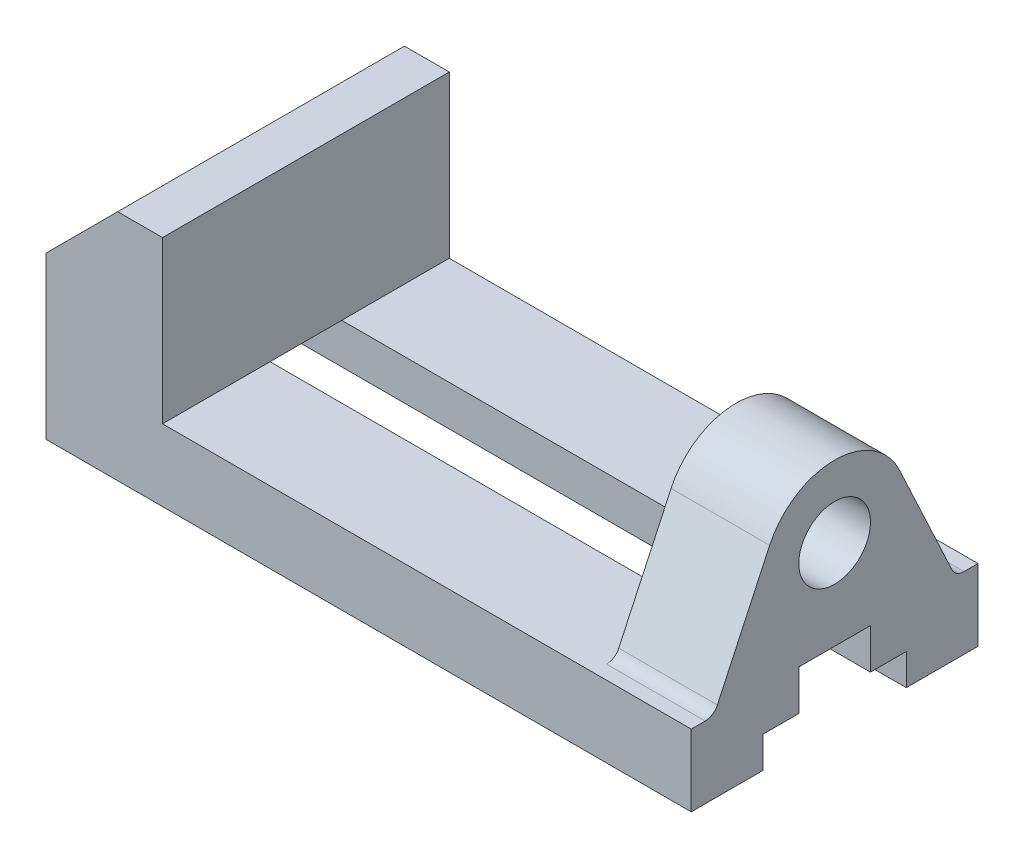
ISO-10303-21;
HEADER;
FILE_DESCRIPTION(('STEP AP214'),'2;1');
FILE_NAME('part.step','',(''),(''),'','','');
FILE_SCHEMA(('AUTOMOTIVE_DESIGN { 1 0 10303 214 1 1 1 1 }'));
ENDSEC;
DATA;
#1=APPLICATION_CONTEXT('core data for automotive mechanical design processes');
#2=APPLICATION_PROTOCOL_DEFINITION('international standard','automotive_design',2000,#1);
#3=PRODUCT_CONTEXT('',#1,'mechanical');
#4=PRODUCT('Part','Part','',(#3));
#5=PRODUCT_RELATED_PRODUCT_CATEGORY('part','',(#4));
#6=PRODUCT_DEFINITION_FORMATION('','',#4);
#7=PRODUCT_DEFINITION_CONTEXT('part definition',#1,'design');
#8=PRODUCT_DEFINITION('design','',#6,#7);
#9=PRODUCT_DEFINITION_SHAPE('','',#8);
#10=(LENGTH_UNIT() NAMED_UNIT(*) SI_UNIT(.MILLI.,.METRE.));
#11=(NAMED_UNIT(*) PLANE_ANGLE_UNIT() SI_UNIT($,.RADIAN.));
#12=(NAMED_UNIT(*) SI_UNIT($,.STERADIAN.) SOLID_ANGLE_UNIT());
#13=UNCERTAINTY_MEASURE_WITH_UNIT(LENGTH_MEASURE(1.E-05),#10,'distance_accuracy_value','');
#14=(GEOMETRIC_REPRESENTATION_CONTEXT(3) GLOBAL_UNCERTAINTY_ASSIGNED_CONTEXT((#13)) GLOBAL_UNIT_ASSIGNED_CONTEXT((#10,
#11,#12)) REPRESENTATION_CONTEXT('',''));
#15=CARTESIAN_POINT('',(0.,0.,0.));
#16=DIRECTION('',(0.,0.,1.));
#17=DIRECTION('',(1.,0.,0.));
#18=AXIS2_PLACEMENT_3D('',#15,#16,#17);
#19=CARTESIAN_POINT('',(122.,52.,-64.));
#20=DIRECTION('',(-1.,0.,0.));
#21=DIRECTION('',(0.,0.,1.));
#22=AXIS2_PLACEMENT_3D('',#19,#20,#21);
#23=PLANE('',#22);
#24=CARTESIAN_POINT('',(122.,36.,-32.));
#25=DIRECTION('',(1.,0.,0.));
#26=DIRECTION('',(0.,0.,-1.));
#27=AXIS2_PLACEMENT_3D('',#24,#25,#26);
#28=CIRCLE('',#27,8.);
#29=CARTESIAN_POINT('',(122.,36.,-40.));
#30=VERTEX_POINT('',#29);
#31=EDGE_CURVE('E277',#30,#30,#28,.T.);
#32=ORIENTED_EDGE('',*,*,#31,.T.);
#33=EDGE_LOOP('',(#32));
#34=FACE_BOUND('',#33,.T.);
#35=DIRECTION('',(0.,-0.906307787036646,-0.422618261740708));
#36=VECTOR('',#35,1.);
#37=CARTESIAN_POINT('',(122.,9.92656098310482,-61.8122909914164));
#38=LINE('',#37,#36);
#39=CARTESIAN_POINT('',(122.,42.7618921878515,-46.5009245925868));
#40=VERTEX_POINT('',#39);
#41=CARTESIAN_POINT('',(122.,17.7321452147779,-58.1724872878132));
#42=VERTEX_POINT('',#41);
#43=EDGE_CURVE('E285',#40,#42,#38,.T.);
#44=ORIENTED_EDGE('',*,*,#43,.T.);
#45=CARTESIAN_POINT('',(122.,19.,-60.8914106489232));
#46=DIRECTION('',(1.,0.,0.));
#47=DIRECTION('',(0.,0.,-1.));
#48=AXIS2_PLACEMENT_3D('',#45,#46,#47);
#49=CIRCLE('',#48,3.);
#50=CARTESIAN_POINT('',(122.,16.,-60.8914106489232));
#51=VERTEX_POINT('',#50);
#52=EDGE_CURVE('E289',#51,#42,#49,.F.);
#53=ORIENTED_EDGE('',*,*,#52,.F.);
#54=DIRECTION('',(0.,0.,1.));
#55=VECTOR('',#54,1.);
#56=CARTESIAN_POINT('',(122.,16.,-64.));
#57=LINE('',#56,#55);
#58=CARTESIAN_POINT('',(122.,16.,-40.));
#59=VERTEX_POINT('',#58);
#60=EDGE_CURVE('E437',#51,#59,#57,.T.);
#61=ORIENTED_EDGE('',*,*,#60,.T.);
#62=DIRECTION('',(0.,0.,1.));
#63=VECTOR('',#62,1.);
#64=CARTESIAN_POINT('',(122.,16.,-64.));
#65=LINE('',#64,#63);
#66=CARTESIAN_POINT('',(122.,16.,-24.));
#67=VERTEX_POINT('',#66);
#68=EDGE_CURVE('E364',#59,#67,#65,.T.);
#69=ORIENTED_EDGE('',*,*,#68,.T.);
#70=CARTESIAN_POINT('',(122.,16.,-3.1085893510773));
#71=VERTEX_POINT('',#70);
#72=EDGE_CURVE('E438',#67,#71,#57,.T.);
#73=ORIENTED_EDGE('',*,*,#72,.T.);
#74=CARTESIAN_POINT('',(122.,19.,-3.1085893510773));
#75=DIRECTION('',(1.,0.,0.));
#76=DIRECTION('',(0.,0.,-1.));
#77=AXIS2_PLACEMENT_3D('',#74,#75,#76);
#78=CIRCLE('',#77,2.99999999999999);
#79=CARTESIAN_POINT('',(122.,17.7321452147779,-5.82751271218726));
#80=VERTEX_POINT('',#79);
#81=EDGE_CURVE('E304',#71,#80,#78,.T.);
#82=ORIENTED_EDGE('',*,*,#81,.T.);
#83=DIRECTION('',(0.,-0.906307787036653,0.422618261740694));
#84=VECTOR('',#83,1.);
#85=CARTESIAN_POINT('',(122.,59.169347295732,-25.1499973750521));
#86=LINE('',#85,#84);
#87=CARTESIAN_POINT('',(122.,42.7618921878513,-17.4990754074131));
#88=VERTEX_POINT('',#87);
#89=EDGE_CURVE('E307',#88,#80,#86,.T.);
#90=ORIENTED_EDGE('',*,*,#89,.F.);
#91=CARTESIAN_POINT('',(122.,36.,-32.));
#92=DIRECTION('',(1.,0.,0.));
#93=DIRECTION('',(0.,0.,-1.));
#94=AXIS2_PLACEMENT_3D('',#91,#92,#93);
#95=CIRCLE('',#94,16.0000000000005);
#96=EDGE_CURVE('E310',#40,#88,#95,.T.);
#97=ORIENTED_EDGE('',*,*,#96,.F.);
#98=EDGE_LOOP('',(#44,#53,#61,#69,#73,#82,#90,#97));
#99=FACE_BOUND('',#98,.T.);
#100=ADVANCED_FACE('F76',(#34,#99),#23,.T.);
#101=CARTESIAN_POINT('',(144.,0.,-64.));
#102=DIRECTION('',(1.,0.,0.));
#103=DIRECTION('',(0.,0.,-1.));
#104=AXIS2_PLACEMENT_3D('',#101,#102,#103);
#105=PLANE('',#104);
#106=CARTESIAN_POINT('',(144.,36.,-32.));
#107=DIRECTION('',(1.,0.,0.));
#108=DIRECTION('',(0.,0.,-1.));
#109=AXIS2_PLACEMENT_3D('',#106,#107,#108);
#110=CIRCLE('',#109,8.);
#111=CARTESIAN_POINT('',(144.,36.,-40.));
#112=VERTEX_POINT('',#111);
#113=EDGE_CURVE('E276',#112,#112,#110,.T.);
#114=ORIENTED_EDGE('',*,*,#113,.F.);
#115=EDGE_LOOP('',(#114));
#116=FACE_BOUND('',#115,.T.);
#117=DIRECTION('',(0.,-0.906307787036646,-0.422618261740708));
#118=VECTOR('',#117,1.);
#119=CARTESIAN_POINT('',(144.,9.92656098310482,-61.8122909914164));
#120=LINE('',#119,#118);
#121=CARTESIAN_POINT('',(144.,42.7618921878515,-46.5009245925868));
#122=VERTEX_POINT('',#121);
#123=CARTESIAN_POINT('',(144.,17.7321452147779,-58.1724872878132));
#124=VERTEX_POINT('',#123);
#125=EDGE_CURVE('E292',#122,#124,#120,.T.);
#126=ORIENTED_EDGE('',*,*,#125,.F.);
#127=CARTESIAN_POINT('',(144.,36.,-32.));
#128=DIRECTION('',(1.,0.,0.));
#129=DIRECTION('',(0.,0.,-1.));
#130=AXIS2_PLACEMENT_3D('',#127,#128,#129);
#131=CIRCLE('',#130,16.0000000000005);
#132=CARTESIAN_POINT('',(144.,42.7618921878513,-17.4990754074131));
#133=VERTEX_POINT('',#132);
#134=EDGE_CURVE('E308',#122,#133,#131,.T.);
#135=ORIENTED_EDGE('',*,*,#134,.T.);
#136=DIRECTION('',(0.,-0.906307787036653,0.422618261740694));
#137=VECTOR('',#136,1.);
#138=CARTESIAN_POINT('',(144.,59.169347295732,-25.1499973750521));
#139=LINE('',#138,#137);
#140=CARTESIAN_POINT('',(144.,17.7321452147779,-5.82751271218726));
#141=VERTEX_POINT('',#140);
#142=EDGE_CURVE('E318',#133,#141,#139,.T.);
#143=ORIENTED_EDGE('',*,*,#142,.T.);
#144=CARTESIAN_POINT('',(144.,19.,-3.1085893510773));
#145=DIRECTION('',(1.,0.,0.));
#146=DIRECTION('',(0.,0.,-1.));
#147=AXIS2_PLACEMENT_3D('',#144,#145,#146);
#148=CIRCLE('',#147,2.99999999999999);
#149=CARTESIAN_POINT('',(144.,16.,-3.1085893510773));
#150=VERTEX_POINT('',#149);
#151=EDGE_CURVE('E315',#150,#141,#148,.T.);
#152=ORIENTED_EDGE('',*,*,#151,.F.);
#153=DIRECTION('',(0.,0.,-1.));
#154=VECTOR('',#153,1.);
#155=CARTESIAN_POINT('',(144.,16.0000000000001,-96.2818921995356));
#156=LINE('',#155,#154);
#157=CARTESIAN_POINT('',(144.,16.,0.));
#158=VERTEX_POINT('',#157);
#159=EDGE_CURVE('E295',#158,#150,#156,.T.);
#160=ORIENTED_EDGE('',*,*,#159,.F.);
#161=DIRECTION('',(0.,1.,0.));
#162=VECTOR('',#161,1.);
#163=CARTESIAN_POINT('',(144.,0.,0.));
#164=LINE('',#163,#162);
#165=CARTESIAN_POINT('',(144.,0.,0.));
#166=VERTEX_POINT('',#165);
#167=EDGE_CURVE('E416',#166,#158,#164,.T.);
#168=ORIENTED_EDGE('',*,*,#167,.F.);
#169=DIRECTION('',(0.,0.,1.));
#170=VECTOR('',#169,1.);
#171=CARTESIAN_POINT('',(144.,0.,-64.));
#172=LINE('',#171,#170);
#173=CARTESIAN_POINT('',(144.,0.,-16.));
#174=VERTEX_POINT('',#173);
#175=EDGE_CURVE('E441',#174,#166,#172,.T.);
#176=ORIENTED_EDGE('',*,*,#175,.F.);
#177=DIRECTION('',(0.,1.,0.));
#178=VECTOR('',#177,1.);
#179=CARTESIAN_POINT('',(144.,-3.62997915668383,-16.));
#180=LINE('',#179,#178);
#181=CARTESIAN_POINT('',(144.,7.,-16.));
#182=VERTEX_POINT('',#181);
#183=EDGE_CURVE('E101',#174,#182,#180,.T.);
#184=ORIENTED_EDGE('',*,*,#183,.T.);
#185=DIRECTION('',(0.,0.,-1.));
#186=VECTOR('',#185,1.);
#187=CARTESIAN_POINT('',(144.,7.,-132.72785902642));
#188=LINE('',#187,#186);
#189=CARTESIAN_POINT('',(144.,7.,-24.));
#190=VERTEX_POINT('',#189);
#191=EDGE_CURVE('E358',#182,#190,#188,.T.);
#192=ORIENTED_EDGE('',*,*,#191,.T.);
#193=DIRECTION('',(0.,1.,0.));
#194=VECTOR('',#193,1.);
#195=CARTESIAN_POINT('',(144.,-3.62997915668383,-24.));
#196=LINE('',#195,#194);
#197=CARTESIAN_POINT('',(144.,16.,-24.));
#198=VERTEX_POINT('',#197);
#199=EDGE_CURVE('E355',#190,#198,#196,.T.);
#200=ORIENTED_EDGE('',*,*,#199,.T.);
#201=DIRECTION('',(0.,0.,-1.));
#202=VECTOR('',#201,1.);
#203=CARTESIAN_POINT('',(144.,16.,-132.72785902642));
#204=LINE('',#203,#202);
#205=CARTESIAN_POINT('',(144.,16.,-40.));
#206=VERTEX_POINT('',#205);
#207=EDGE_CURVE('E352',#198,#206,#204,.T.);
#208=ORIENTED_EDGE('',*,*,#207,.T.);
#209=DIRECTION('',(0.,-1.,0.));
#210=VECTOR('',#209,1.);
#211=CARTESIAN_POINT('',(144.,-3.62997915668383,-40.));
#212=LINE('',#211,#210);
#213=CARTESIAN_POINT('',(144.,7.,-40.));
#214=VERTEX_POINT('',#213);
#215=EDGE_CURVE('E349',#206,#214,#212,.T.);
#216=ORIENTED_EDGE('',*,*,#215,.T.);
#217=DIRECTION('',(0.,0.,-1.));
#218=VECTOR('',#217,1.);
#219=CARTESIAN_POINT('',(144.,7.,-132.72785902642));
#220=LINE('',#219,#218);
#221=CARTESIAN_POINT('',(144.,7.,-48.));
#222=VERTEX_POINT('',#221);
#223=EDGE_CURVE('E346',#214,#222,#220,.T.);
#224=ORIENTED_EDGE('',*,*,#223,.T.);
#225=DIRECTION('',(0.,-1.,0.));
#226=VECTOR('',#225,1.);
#227=CARTESIAN_POINT('',(144.,-3.62997915668383,-48.));
#228=LINE('',#227,#226);
#229=CARTESIAN_POINT('',(144.,0.,-48.));
#230=VERTEX_POINT('',#229);
#231=EDGE_CURVE('E325',#222,#230,#228,.T.);
#232=ORIENTED_EDGE('',*,*,#231,.T.);
#233=CARTESIAN_POINT('',(144.,0.,-64.));
#234=VERTEX_POINT('',#233);
#235=EDGE_CURVE('E439',#234,#230,#172,.T.);
#236=ORIENTED_EDGE('',*,*,#235,.F.);
#237=DIRECTION('',(0.,1.,0.));
#238=VECTOR('',#237,1.);
#239=CARTESIAN_POINT('',(144.,0.,-64.));
#240=LINE('',#239,#238);
#241=CARTESIAN_POINT('',(144.,16.,-64.));
#242=VERTEX_POINT('',#241);
#243=EDGE_CURVE('E395',#234,#242,#240,.T.);
#244=ORIENTED_EDGE('',*,*,#243,.T.);
#245=DIRECTION('',(0.,0.,-1.));
#246=VECTOR('',#245,1.);
#247=CARTESIAN_POINT('',(144.,15.9999999999999,-96.2818921995356));
#248=LINE('',#247,#246);
#249=CARTESIAN_POINT('',(144.,16.,-60.8914106489232));
#250=VERTEX_POINT('',#249);
#251=EDGE_CURVE('E296',#250,#242,#248,.T.);
#252=ORIENTED_EDGE('',*,*,#251,.F.);
#253=CARTESIAN_POINT('',(144.,19.,-60.8914106489232));
#254=DIRECTION('',(1.,0.,0.));
#255=DIRECTION('',(0.,0.,-1.));
#256=AXIS2_PLACEMENT_3D('',#253,#254,#255);
#257=CIRCLE('',#256,3.);
#258=EDGE_CURVE('E280',#250,#124,#257,.F.);
#259=ORIENTED_EDGE('',*,*,#258,.T.);
#260=EDGE_LOOP('',(#126,#135,#143,#152,#160,#168,#176,#184,#192,#200,#208,#216,#224,#232,#236,
#244,#252,#259));
#261=FACE_BOUND('',#260,.T.);
#262=ADVANCED_FACE('F477',(#116,#261),#105,.T.);
#263=CARTESIAN_POINT('',(0.,0.,-64.));
#264=DIRECTION('',(-1.,0.,0.));
#265=DIRECTION('',(0.,0.,1.));
#266=AXIS2_PLACEMENT_3D('',#263,#264,#265);
#267=PLANE('',#266);
#268=DIRECTION('',(0.,0.,1.));
#269=VECTOR('',#268,1.);
#270=CARTESIAN_POINT('',(0.,0.,-64.));
#271=LINE('',#270,#269);
#272=CARTESIAN_POINT('',(0.,0.,-64.));
#273=VERTEX_POINT('',#272);
#274=CARTESIAN_POINT('',(0.,0.,-48.));
#275=VERTEX_POINT('',#274);
#276=EDGE_CURVE('E80',#273,#275,#271,.T.);
#277=ORIENTED_EDGE('',*,*,#276,.T.);
#278=DIRECTION('',(0.,-1.,0.));
#279=VECTOR('',#278,1.);
#280=CARTESIAN_POINT('',(0.,-3.62997915668383,-48.));
#281=LINE('',#280,#279);
#282=CARTESIAN_POINT('',(0.,7.,-48.));
#283=VERTEX_POINT('',#282);
#284=EDGE_CURVE('E329',#283,#275,#281,.T.);
#285=ORIENTED_EDGE('',*,*,#284,.F.);
#286=DIRECTION('',(0.,0.,-1.));
#287=VECTOR('',#286,1.);
#288=CARTESIAN_POINT('',(0.,7.,-132.72785902642));
#289=LINE('',#288,#287);
#290=CARTESIAN_POINT('',(0.,7.,-40.));
#291=VERTEX_POINT('',#290);
#292=EDGE_CURVE('E331',#291,#283,#289,.T.);
#293=ORIENTED_EDGE('',*,*,#292,.F.);
#294=DIRECTION('',(0.,-1.,0.));
#295=VECTOR('',#294,1.);
#296=CARTESIAN_POINT('',(0.,-3.62997915668383,-40.));
#297=LINE('',#296,#295);
#298=CARTESIAN_POINT('',(0.,16.,-40.));
#299=VERTEX_POINT('',#298);
#300=EDGE_CURVE('E333',#299,#291,#297,.T.);
#301=ORIENTED_EDGE('',*,*,#300,.F.);
#302=DIRECTION('',(0.,0.,-1.));
#303=VECTOR('',#302,1.);
#304=CARTESIAN_POINT('',(0.,16.,-132.72785902642));
#305=LINE('',#304,#303);
#306=CARTESIAN_POINT('',(0.,16.,-24.));
#307=VERTEX_POINT('',#306);
#308=EDGE_CURVE('E335',#307,#299,#305,.T.);
#309=ORIENTED_EDGE('',*,*,#308,.F.);
#310=DIRECTION('',(0.,1.,0.));
#311=VECTOR('',#310,1.);
#312=CARTESIAN_POINT('',(0.,-3.62997915668383,-24.));
#313=LINE('',#312,#311);
#314=CARTESIAN_POINT('',(0.,7.,-24.));
#315=VERTEX_POINT('',#314);
#316=EDGE_CURVE('E337',#315,#307,#313,.T.);
#317=ORIENTED_EDGE('',*,*,#316,.F.);
#318=DIRECTION('',(0.,0.,-1.));
#319=VECTOR('',#318,1.);
#320=CARTESIAN_POINT('',(0.,7.,-132.72785902642));
#321=LINE('',#320,#319);
#322=CARTESIAN_POINT('',(0.,7.,-16.));
#323=VERTEX_POINT('',#322);
#324=EDGE_CURVE('E339',#323,#315,#321,.T.);
#325=ORIENTED_EDGE('',*,*,#324,.F.);
#326=DIRECTION('',(0.,1.,0.));
#327=VECTOR('',#326,1.);
#328=CARTESIAN_POINT('',(0.,-3.62997915668383,-16.));
#329=LINE('',#328,#327);
#330=CARTESIAN_POINT('',(0.,0.,-16.));
#331=VERTEX_POINT('',#330);
#332=EDGE_CURVE('E341',#331,#323,#329,.T.);
#333=ORIENTED_EDGE('',*,*,#332,.F.);
#334=CARTESIAN_POINT('',(0.,0.,0.));
#335=VERTEX_POINT('',#334);
#336=EDGE_CURVE('E410',#331,#335,#271,.T.);
#337=ORIENTED_EDGE('',*,*,#336,.T.);
#338=DIRECTION('',(0.,-1.,0.));
#339=VECTOR('',#338,1.);
#340=CARTESIAN_POINT('',(0.,0.,0.));
#341=LINE('',#340,#339);
#342=CARTESIAN_POINT('',(0.,36.,0.));
#343=VERTEX_POINT('',#342);
#344=EDGE_CURVE('E387',#343,#335,#341,.T.);
#345=ORIENTED_EDGE('',*,*,#344,.F.);
#346=DIRECTION('',(0.,0.,1.));
#347=VECTOR('',#346,1.);
#348=CARTESIAN_POINT('',(0.,36.,-64.));
#349=LINE('',#348,#347);
#350=CARTESIAN_POINT('',(0.,36.,-64.));
#351=VERTEX_POINT('',#350);
#352=EDGE_CURVE('E12',#351,#343,#349,.T.);
#353=ORIENTED_EDGE('',*,*,#352,.F.);
#354=DIRECTION('',(0.,-1.,0.));
#355=VECTOR('',#354,1.);
#356=CARTESIAN_POINT('',(0.,0.,-64.));
#357=LINE('',#356,#355);
#358=EDGE_CURVE('E388',#351,#273,#357,.T.);
#359=ORIENTED_EDGE('',*,*,#358,.T.);
#360=EDGE_LOOP('',(#277,#285,#293,#301,#309,#317,#325,#333,#337,#345,#353,#359));
#361=FACE_BOUND('',#360,.T.);
#362=ADVANCED_FACE('F78',(#361),#267,.T.);
#363=CARTESIAN_POINT('',(122.,16.,-64.));
#364=DIRECTION('',(0.,1.,0.));
#365=DIRECTION('',(-1.,0.,0.));
#366=AXIS2_PLACEMENT_3D('',#363,#364,#365);
#367=PLANE('',#366);
#368=ORIENTED_EDGE('',*,*,#72,.F.);
#369=DIRECTION('',(1.,0.,0.));
#370=VECTOR('',#369,1.);
#371=CARTESIAN_POINT('',(0.,16.,-24.));
#372=LINE('',#371,#370);
#373=CARTESIAN_POINT('',(26.,16.,-24.));
#374=VERTEX_POINT('',#373);
#375=EDGE_CURVE('E93',#374,#67,#372,.T.);
#376=ORIENTED_EDGE('',*,*,#375,.F.);
#377=DIRECTION('',(0.,0.,1.));
#378=VECTOR('',#377,1.);
#379=CARTESIAN_POINT('',(26.,16.,-64.));
#380=LINE('',#379,#378);
#381=CARTESIAN_POINT('',(26.,16.,0.));
#382=VERTEX_POINT('',#381);
#383=EDGE_CURVE('E436',#374,#382,#380,.T.);
#384=ORIENTED_EDGE('',*,*,#383,.T.);
#385=DIRECTION('',(-1.,0.,0.));
#386=VECTOR('',#385,1.);
#387=CARTESIAN_POINT('',(122.,16.,0.));
#388=LINE('',#387,#386);
#389=EDGE_CURVE('E419',#158,#382,#388,.T.);
#390=ORIENTED_EDGE('',*,*,#389,.F.);
#391=ORIENTED_EDGE('',*,*,#159,.T.);
#392=DIRECTION('',(1.,0.,0.));
#393=VECTOR('',#392,1.);
#394=CARTESIAN_POINT('',(122.,16.,-3.1085893510773));
#395=LINE('',#394,#393);
#396=EDGE_CURVE('E312',#71,#150,#395,.T.);
#397=ORIENTED_EDGE('',*,*,#396,.F.);
#398=EDGE_LOOP('',(#368,#376,#384,#390,#391,#397));
#399=FACE_BOUND('',#398,.T.);
#400=ADVANCED_FACE('F509',(#399),#367,.T.);
#401=CARTESIAN_POINT('',(26.,16.,-64.));
#402=VERTEX_POINT('',#401);
#403=CARTESIAN_POINT('',(26.,16.,-40.));
#404=VERTEX_POINT('',#403);
#405=EDGE_CURVE('E433',#402,#404,#380,.T.);
#406=ORIENTED_EDGE('',*,*,#405,.T.);
#407=DIRECTION('',(1.,0.,0.));
#408=VECTOR('',#407,1.);
#409=CARTESIAN_POINT('',(0.,16.,-40.));
#410=LINE('',#409,#408);
#411=EDGE_CURVE('E377',#404,#59,#410,.T.);
#412=ORIENTED_EDGE('',*,*,#411,.T.);
#413=ORIENTED_EDGE('',*,*,#60,.F.);
#414=DIRECTION('',(1.,0.,0.));
#415=VECTOR('',#414,1.);
#416=CARTESIAN_POINT('',(122.,16.,-60.8914106489232));
#417=LINE('',#416,#415);
#418=EDGE_CURVE('E283',#51,#250,#417,.T.);
#419=ORIENTED_EDGE('',*,*,#418,.T.);
#420=ORIENTED_EDGE('',*,*,#251,.T.);
#421=DIRECTION('',(-1.,0.,0.));
#422=VECTOR('',#421,1.);
#423=CARTESIAN_POINT('',(122.,16.,-64.));
#424=LINE('',#423,#422);
#425=EDGE_CURVE('E398',#242,#402,#424,.T.);
#426=ORIENTED_EDGE('',*,*,#425,.T.);
#427=EDGE_LOOP('',(#406,#412,#413,#419,#420,#426));
#428=FACE_BOUND('',#427,.T.);
#429=ADVANCED_FACE('F501',(#428),#367,.T.);
#430=CARTESIAN_POINT('',(0.,0.,-64.));
#431=DIRECTION('',(0.,-1.,0.));
#432=DIRECTION('',(0.,0.,-1.));
#433=AXIS2_PLACEMENT_3D('',#430,#431,#432);
#434=PLANE('',#433);
#435=CARTESIAN_POINT('',(108.,0.,-54.));
#436=DIRECTION('',(0.,-1.,0.));
#437=DIRECTION('',(0.,0.,-1.));
#438=AXIS2_PLACEMENT_3D('',#435,#436,#437);
#439=CIRCLE('',#438,2.99999999999999);
#440=CARTESIAN_POINT('',(108.,0.,-57.));
#441=VERTEX_POINT('',#440);
#442=EDGE_CURVE('E264',#441,#441,#439,.T.);
#443=ORIENTED_EDGE('',*,*,#442,.F.);
#444=EDGE_LOOP('',(#443));
#445=FACE_BOUND('',#444,.T.);
#446=CARTESIAN_POINT('',(38.,0.,-54.));
#447=DIRECTION('',(0.,-1.,0.));
#448=DIRECTION('',(0.,0.,-1.));
#449=AXIS2_PLACEMENT_3D('',#446,#447,#448);
#450=CIRCLE('',#449,2.99999999999999);
#451=CARTESIAN_POINT('',(38.,0.,-57.));
#452=VERTEX_POINT('',#451);
#453=EDGE_CURVE('E270',#452,#452,#450,.T.);
#454=ORIENTED_EDGE('',*,*,#453,.F.);
#455=EDGE_LOOP('',(#454));
#456=FACE_BOUND('',#455,.T.);
#457=ORIENTED_EDGE('',*,*,#235,.T.);
#458=DIRECTION('',(1.,0.,0.));
#459=VECTOR('',#458,1.);
#460=CARTESIAN_POINT('',(0.,0.,-48.));
#461=LINE('',#460,#459);
#462=EDGE_CURVE('E362',#275,#230,#461,.T.);
#463=ORIENTED_EDGE('',*,*,#462,.F.);
#464=ORIENTED_EDGE('',*,*,#276,.F.);
#465=DIRECTION('',(1.,0.,0.));
#466=VECTOR('',#465,1.);
#467=CARTESIAN_POINT('',(0.,0.,-64.));
#468=LINE('',#467,#466);
#469=EDGE_CURVE('E391',#273,#234,#468,.T.);
#470=ORIENTED_EDGE('',*,*,#469,.T.);
#471=EDGE_LOOP('',(#457,#463,#464,#470));
#472=FACE_BOUND('',#471,.T.);
#473=ADVANCED_FACE('F470',(#445,#456,#472),#434,.T.);
#474=CARTESIAN_POINT('',(38.,0.,-10.));
#475=DIRECTION('',(0.,-1.,0.));
#476=DIRECTION('',(0.,0.,-1.));
#477=AXIS2_PLACEMENT_3D('',#474,#475,#476);
#478=CIRCLE('',#477,2.99999999999999);
#479=CARTESIAN_POINT('',(38.,0.,-13.));
#480=VERTEX_POINT('',#479);
#481=EDGE_CURVE('E254',#480,#480,#478,.T.);
#482=ORIENTED_EDGE('',*,*,#481,.F.);
#483=EDGE_LOOP('',(#482));
#484=FACE_BOUND('',#483,.T.);
#485=CARTESIAN_POINT('',(108.,0.,-10.));
#486=DIRECTION('',(0.,-1.,0.));
#487=DIRECTION('',(0.,0.,-1.));
#488=AXIS2_PLACEMENT_3D('',#485,#486,#487);
#489=CIRCLE('',#488,2.99999999999999);
#490=CARTESIAN_POINT('',(108.,0.,-13.));
#491=VERTEX_POINT('',#490);
#492=EDGE_CURVE('E253',#491,#491,#489,.T.);
#493=ORIENTED_EDGE('',*,*,#492,.F.);
#494=EDGE_LOOP('',(#493));
#495=FACE_BOUND('',#494,.T.);
#496=ORIENTED_EDGE('',*,*,#336,.F.);
#497=DIRECTION('',(1.,0.,0.));
#498=VECTOR('',#497,1.);
#499=CARTESIAN_POINT('',(0.,0.,-16.));
#500=LINE('',#499,#498);
#501=EDGE_CURVE('E365',#331,#174,#500,.T.);
#502=ORIENTED_EDGE('',*,*,#501,.T.);
#503=ORIENTED_EDGE('',*,*,#175,.T.);
#504=DIRECTION('',(1.,0.,0.));
#505=VECTOR('',#504,1.);
#506=CARTESIAN_POINT('',(0.,0.,0.));
#507=LINE('',#506,#505);
#508=EDGE_CURVE('E413',#335,#166,#507,.T.);
#509=ORIENTED_EDGE('',*,*,#508,.F.);
#510=EDGE_LOOP('',(#496,#502,#503,#509));
#511=FACE_BOUND('',#510,.T.);
#512=ADVANCED_FACE('F456',(#484,#495,#511),#434,.T.);
#513=CARTESIAN_POINT('',(0.,36.,-64.));
#514=DIRECTION('',(-0.707106781186548,0.707106781186547,0.));
#515=DIRECTION('',(-0.707106781186547,-0.707106781186548,0.));
#516=AXIS2_PLACEMENT_3D('',#513,#514,#515);
#517=PLANE('',#516);
#518=DIRECTION('',(-0.707106781186547,-0.707106781186548,0.));
#519=VECTOR('',#518,1.);
#520=CARTESIAN_POINT('',(0.,36.,0.));
#521=LINE('',#520,#519);
#522=CARTESIAN_POINT('',(16.,52.,0.));
#523=VERTEX_POINT('',#522);
#524=EDGE_CURVE('E392',#523,#343,#521,.T.);
#525=ORIENTED_EDGE('',*,*,#524,.F.);
#526=DIRECTION('',(0.,0.,1.));
#527=VECTOR('',#526,1.);
#528=CARTESIAN_POINT('',(16.,52.,-64.));
#529=LINE('',#528,#527);
#530=CARTESIAN_POINT('',(16.,52.,-64.));
#531=VERTEX_POINT('',#530);
#532=EDGE_CURVE('E85',#531,#523,#529,.T.);
#533=ORIENTED_EDGE('',*,*,#532,.F.);
#534=DIRECTION('',(-0.707106781186547,-0.707106781186548,0.));
#535=VECTOR('',#534,1.);
#536=CARTESIAN_POINT('',(0.,36.,-64.));
#537=LINE('',#536,#535);
#538=EDGE_CURVE('E407',#531,#351,#537,.T.);
#539=ORIENTED_EDGE('',*,*,#538,.T.);
#540=ORIENTED_EDGE('',*,*,#352,.T.);
#541=EDGE_LOOP('',(#525,#533,#539,#540));
#542=FACE_BOUND('',#541,.T.);
#543=ADVANCED_FACE('F462',(#542),#517,.T.);
#544=CARTESIAN_POINT('',(26.,52.,-64.));
#545=DIRECTION('',(0.,1.,0.));
#546=DIRECTION('',(0.,0.,1.));
#547=AXIS2_PLACEMENT_3D('',#544,#545,#546);
#548=PLANE('',#547);
#549=DIRECTION('',(-1.,0.,0.));
#550=VECTOR('',#549,1.);
#551=CARTESIAN_POINT('',(26.,52.,0.));
#552=LINE('',#551,#550);
#553=CARTESIAN_POINT('',(26.,52.,0.));
#554=VERTEX_POINT('',#553);
#555=EDGE_CURVE('E425',#554,#523,#552,.T.);
#556=ORIENTED_EDGE('',*,*,#555,.F.);
#557=DIRECTION('',(0.,0.,1.));
#558=VECTOR('',#557,1.);
#559=CARTESIAN_POINT('',(26.,52.,-64.));
#560=LINE('',#559,#558);
#561=CARTESIAN_POINT('',(26.,52.,-64.));
#562=VERTEX_POINT('',#561);
#563=EDGE_CURVE('E431',#562,#554,#560,.T.);
#564=ORIENTED_EDGE('',*,*,#563,.F.);
#565=DIRECTION('',(-1.,0.,0.));
#566=VECTOR('',#565,1.);
#567=CARTESIAN_POINT('',(26.,52.,-64.));
#568=LINE('',#567,#566);
#569=EDGE_CURVE('E404',#562,#531,#568,.T.);
#570=ORIENTED_EDGE('',*,*,#569,.T.);
#571=ORIENTED_EDGE('',*,*,#532,.T.);
#572=EDGE_LOOP('',(#556,#564,#570,#571));
#573=FACE_BOUND('',#572,.T.);
#574=ADVANCED_FACE('F505',(#573),#548,.T.);
#575=CARTESIAN_POINT('',(26.,16.,-64.));
#576=DIRECTION('',(1.,0.,0.));
#577=DIRECTION('',(0.,0.,-1.));
#578=AXIS2_PLACEMENT_3D('',#575,#576,#577);
#579=PLANE('',#578);
#580=DIRECTION('',(0.,1.,0.));
#581=VECTOR('',#580,1.);
#582=CARTESIAN_POINT('',(26.,16.,0.));
#583=LINE('',#582,#581);
#584=EDGE_CURVE('E422',#382,#554,#583,.T.);
#585=ORIENTED_EDGE('',*,*,#584,.F.);
#586=ORIENTED_EDGE('',*,*,#383,.F.);
#587=DIRECTION('',(0.,0.,-1.));
#588=VECTOR('',#587,1.);
#589=CARTESIAN_POINT('',(26.,16.,-64.));
#590=LINE('',#589,#588);
#591=EDGE_CURVE('E384',#374,#404,#590,.T.);
#592=ORIENTED_EDGE('',*,*,#591,.T.);
#593=ORIENTED_EDGE('',*,*,#405,.F.);
#594=DIRECTION('',(0.,1.,0.));
#595=VECTOR('',#594,1.);
#596=CARTESIAN_POINT('',(26.,16.,-64.));
#597=LINE('',#596,#595);
#598=EDGE_CURVE('E401',#402,#562,#597,.T.);
#599=ORIENTED_EDGE('',*,*,#598,.T.);
#600=ORIENTED_EDGE('',*,*,#563,.T.);
#601=EDGE_LOOP('',(#585,#586,#592,#593,#599,#600));
#602=FACE_BOUND('',#601,.T.);
#603=ADVANCED_FACE('F498',(#602),#579,.T.);
#604=CARTESIAN_POINT('',(0.,52.,-64.));
#605=DIRECTION('',(0.,0.,1.));
#606=DIRECTION('',(1.,0.,0.));
#607=AXIS2_PLACEMENT_3D('',#604,#605,#606);
#608=PLANE('',#607);
#609=ORIENTED_EDGE('',*,*,#425,.F.);
#610=ORIENTED_EDGE('',*,*,#243,.F.);
#611=ORIENTED_EDGE('',*,*,#469,.F.);
#612=ORIENTED_EDGE('',*,*,#358,.F.);
#613=ORIENTED_EDGE('',*,*,#538,.F.);
#614=ORIENTED_EDGE('',*,*,#569,.F.);
#615=ORIENTED_EDGE('',*,*,#598,.F.);
#616=EDGE_LOOP('',(#609,#610,#611,#612,#613,#614,#615));
#617=FACE_BOUND('',#616,.T.);
#618=ADVANCED_FACE('F467',(#617),#608,.F.);
#619=CARTESIAN_POINT('',(0.,52.,0.));
#620=DIRECTION('',(0.,0.,1.));
#621=DIRECTION('',(1.,0.,0.));
#622=AXIS2_PLACEMENT_3D('',#619,#620,#621);
#623=PLANE('',#622);
#624=ORIENTED_EDGE('',*,*,#167,.T.);
#625=ORIENTED_EDGE('',*,*,#389,.T.);
#626=ORIENTED_EDGE('',*,*,#584,.T.);
#627=ORIENTED_EDGE('',*,*,#555,.T.);
#628=ORIENTED_EDGE('',*,*,#524,.T.);
#629=ORIENTED_EDGE('',*,*,#344,.T.);
#630=ORIENTED_EDGE('',*,*,#508,.T.);
#631=EDGE_LOOP('',(#624,#625,#626,#627,#628,#629,#630));
#632=FACE_BOUND('',#631,.T.);
#633=ADVANCED_FACE('F458',(#632),#623,.T.);
#634=CARTESIAN_POINT('',(0.,16.,-132.72785902642));
#635=DIRECTION('',(0.,-1.,0.));
#636=DIRECTION('',(0.,0.,-1.));
#637=AXIS2_PLACEMENT_3D('',#634,#635,#636);
#638=PLANE('',#637);
#639=EDGE_CURVE('E371',#307,#374,#372,.T.);
#640=ORIENTED_EDGE('',*,*,#639,.F.);
#641=ORIENTED_EDGE('',*,*,#308,.T.);
#642=EDGE_CURVE('E374',#299,#404,#410,.T.);
#643=ORIENTED_EDGE('',*,*,#642,.T.);
#644=ORIENTED_EDGE('',*,*,#591,.F.);
#645=EDGE_LOOP('',(#640,#641,#643,#644));
#646=FACE_BOUND('',#645,.T.);
#647=ADVANCED_FACE('F494',(#646),#638,.T.);
#648=CARTESIAN_POINT('',(0.,-3.62997915668383,-48.));
#649=DIRECTION('',(0.,0.,1.));
#650=DIRECTION('',(1.,0.,0.));
#651=AXIS2_PLACEMENT_3D('',#648,#649,#650);
#652=PLANE('',#651);
#653=ORIENTED_EDGE('',*,*,#231,.F.);
#654=DIRECTION('',(1.,0.,0.));
#655=VECTOR('',#654,1.);
#656=CARTESIAN_POINT('',(0.,7.,-48.));
#657=LINE('',#656,#655);
#658=EDGE_CURVE('E343',#283,#222,#657,.T.);
#659=ORIENTED_EDGE('',*,*,#658,.F.);
#660=ORIENTED_EDGE('',*,*,#284,.T.);
#661=ORIENTED_EDGE('',*,*,#462,.T.);
#662=EDGE_LOOP('',(#653,#659,#660,#661));
#663=FACE_BOUND('',#662,.T.);
#664=ADVANCED_FACE('F473',(#663),#652,.T.);
#665=CARTESIAN_POINT('',(0.,-3.62997915668383,-16.));
#666=DIRECTION('',(0.,0.,-1.));
#667=DIRECTION('',(-1.,0.,0.));
#668=AXIS2_PLACEMENT_3D('',#665,#666,#667);
#669=PLANE('',#668);
#670=ORIENTED_EDGE('',*,*,#183,.F.);
#671=ORIENTED_EDGE('',*,*,#501,.F.);
#672=ORIENTED_EDGE('',*,*,#332,.T.);
#673=DIRECTION('',(1.,0.,0.));
#674=VECTOR('',#673,1.);
#675=CARTESIAN_POINT('',(0.,7.,-16.));
#676=LINE('',#675,#674);
#677=EDGE_CURVE('E367',#323,#182,#676,.T.);
#678=ORIENTED_EDGE('',*,*,#677,.T.);
#679=EDGE_LOOP('',(#670,#671,#672,#678));
#680=FACE_BOUND('',#679,.T.);
#681=ADVANCED_FACE('F529',(#680),#669,.T.);
#682=CARTESIAN_POINT('',(0.,7.,-132.72785902642));
#683=DIRECTION('',(0.,-1.,0.));
#684=DIRECTION('',(0.,0.,-1.));
#685=AXIS2_PLACEMENT_3D('',#682,#683,#684);
#686=PLANE('',#685);
#687=ORIENTED_EDGE('',*,*,#191,.F.);
#688=ORIENTED_EDGE('',*,*,#677,.F.);
#689=ORIENTED_EDGE('',*,*,#324,.T.);
#690=DIRECTION('',(1.,0.,0.));
#691=VECTOR('',#690,1.);
#692=CARTESIAN_POINT('',(0.,7.,-24.));
#693=LINE('',#692,#691);
#694=EDGE_CURVE('E369',#315,#190,#693,.T.);
#695=ORIENTED_EDGE('',*,*,#694,.T.);
#696=EDGE_LOOP('',(#687,#688,#689,#695));
#697=FACE_BOUND('',#696,.T.);
#698=ADVANCED_FACE('F528',(#697),#686,.T.);
#699=CARTESIAN_POINT('',(0.,-3.62997915668383,-24.));
#700=DIRECTION('',(0.,0.,-1.));
#701=DIRECTION('',(-1.,0.,0.));
#702=AXIS2_PLACEMENT_3D('',#699,#700,#701);
#703=PLANE('',#702);
#704=ORIENTED_EDGE('',*,*,#199,.F.);
#705=ORIENTED_EDGE('',*,*,#694,.F.);
#706=ORIENTED_EDGE('',*,*,#316,.T.);
#707=ORIENTED_EDGE('',*,*,#639,.T.);
#708=ORIENTED_EDGE('',*,*,#375,.T.);
#709=EDGE_CURVE('E373',#67,#198,#372,.T.);
#710=ORIENTED_EDGE('',*,*,#709,.T.);
#711=EDGE_LOOP('',(#704,#705,#706,#707,#708,#710));
#712=FACE_BOUND('',#711,.T.);
#713=ADVANCED_FACE('F525',(#712),#703,.T.);
#714=EDGE_CURVE('E378',#59,#206,#410,.T.);
#715=ORIENTED_EDGE('',*,*,#714,.T.);
#716=ORIENTED_EDGE('',*,*,#207,.F.);
#717=ORIENTED_EDGE('',*,*,#709,.F.);
#718=ORIENTED_EDGE('',*,*,#68,.F.);
#719=EDGE_LOOP('',(#715,#716,#717,#718));
#720=FACE_BOUND('',#719,.T.);
#721=ADVANCED_FACE('F520',(#720),#638,.T.);
#722=CARTESIAN_POINT('',(0.,-3.62997915668383,-40.));
#723=DIRECTION('',(0.,0.,1.));
#724=DIRECTION('',(1.,0.,0.));
#725=AXIS2_PLACEMENT_3D('',#722,#723,#724);
#726=PLANE('',#725);
#727=ORIENTED_EDGE('',*,*,#215,.F.);
#728=ORIENTED_EDGE('',*,*,#714,.F.);
#729=ORIENTED_EDGE('',*,*,#411,.F.);
#730=ORIENTED_EDGE('',*,*,#642,.F.);
#731=ORIENTED_EDGE('',*,*,#300,.T.);
#732=DIRECTION('',(1.,0.,0.));
#733=VECTOR('',#732,1.);
#734=CARTESIAN_POINT('',(0.,7.,-40.));
#735=LINE('',#734,#733);
#736=EDGE_CURVE('E379',#291,#214,#735,.T.);
#737=ORIENTED_EDGE('',*,*,#736,.T.);
#738=EDGE_LOOP('',(#727,#728,#729,#730,#731,#737));
#739=FACE_BOUND('',#738,.T.);
#740=ADVANCED_FACE('F489',(#739),#726,.T.);
#741=CARTESIAN_POINT('',(0.,7.,-132.72785902642));
#742=DIRECTION('',(0.,-1.,0.));
#743=DIRECTION('',(0.,0.,-1.));
#744=AXIS2_PLACEMENT_3D('',#741,#742,#743);
#745=PLANE('',#744);
#746=ORIENTED_EDGE('',*,*,#223,.F.);
#747=ORIENTED_EDGE('',*,*,#736,.F.);
#748=ORIENTED_EDGE('',*,*,#292,.T.);
#749=ORIENTED_EDGE('',*,*,#658,.T.);
#750=EDGE_LOOP('',(#746,#747,#748,#749));
#751=FACE_BOUND('',#750,.T.);
#752=ADVANCED_FACE('F482',(#751),#745,.T.);
#753=CARTESIAN_POINT('',(122.,36.,-32.));
#754=DIRECTION('',(1.,0.,0.));
#755=DIRECTION('',(0.,0.,-1.));
#756=AXIS2_PLACEMENT_3D('',#753,#754,#755);
#757=CYLINDRICAL_SURFACE('',#756,16.0000000000005);
#758=ORIENTED_EDGE('',*,*,#134,.F.);
#759=DIRECTION('',(1.,0.,0.));
#760=VECTOR('',#759,1.);
#761=CARTESIAN_POINT('',(122.,42.7618921878515,-46.5009245925868));
#762=LINE('',#761,#760);
#763=EDGE_CURVE('E286',#40,#122,#762,.T.);
#764=ORIENTED_EDGE('',*,*,#763,.F.);
#765=ORIENTED_EDGE('',*,*,#96,.T.);
#766=DIRECTION('',(1.,0.,0.));
#767=VECTOR('',#766,1.);
#768=CARTESIAN_POINT('',(122.,42.7618921878513,-17.4990754074131));
#769=LINE('',#768,#767);
#770=EDGE_CURVE('E323',#88,#133,#769,.T.);
#771=ORIENTED_EDGE('',*,*,#770,.T.);
#772=EDGE_LOOP('',(#758,#764,#765,#771));
#773=FACE_BOUND('',#772,.T.);
#774=ADVANCED_FACE('F590',(#773),#757,.T.);
#775=CARTESIAN_POINT('',(122.,59.169347295732,-25.1499973750521));
#776=DIRECTION('',(0.,0.422618261740694,0.906307787036653));
#777=DIRECTION('',(0.,-0.906307787036653,0.422618261740694));
#778=AXIS2_PLACEMENT_3D('',#775,#776,#777);
#779=PLANE('',#778);
#780=ORIENTED_EDGE('',*,*,#142,.F.);
#781=ORIENTED_EDGE('',*,*,#770,.F.);
#782=ORIENTED_EDGE('',*,*,#89,.T.);
#783=DIRECTION('',(1.,0.,0.));
#784=VECTOR('',#783,1.);
#785=CARTESIAN_POINT('',(122.,17.7321452147779,-5.82751271218726));
#786=LINE('',#785,#784);
#787=EDGE_CURVE('E326',#80,#141,#786,.T.);
#788=ORIENTED_EDGE('',*,*,#787,.T.);
#789=EDGE_LOOP('',(#780,#781,#782,#788));
#790=FACE_BOUND('',#789,.T.);
#791=ADVANCED_FACE('F593',(#790),#779,.T.);
#792=CARTESIAN_POINT('',(122.,19.,-3.1085893510773));
#793=DIRECTION('',(1.,0.,0.));
#794=DIRECTION('',(0.,0.,-1.));
#795=AXIS2_PLACEMENT_3D('',#792,#793,#794);
#796=CYLINDRICAL_SURFACE('',#795,2.99999999999999);
#797=ORIENTED_EDGE('',*,*,#151,.T.);
#798=ORIENTED_EDGE('',*,*,#787,.F.);
#799=ORIENTED_EDGE('',*,*,#81,.F.);
#800=ORIENTED_EDGE('',*,*,#396,.T.);
#801=EDGE_LOOP('',(#797,#798,#799,#800));
#802=FACE_BOUND('',#801,.T.);
#803=ADVANCED_FACE('F514',(#802),#796,.F.);
#804=CARTESIAN_POINT('',(122.,19.,-60.8914106489232));
#805=DIRECTION('',(1.,0.,0.));
#806=DIRECTION('',(0.,0.,-1.));
#807=AXIS2_PLACEMENT_3D('',#804,#805,#806);
#808=CYLINDRICAL_SURFACE('',#807,3.);
#809=ORIENTED_EDGE('',*,*,#258,.F.);
#810=ORIENTED_EDGE('',*,*,#418,.F.);
#811=ORIENTED_EDGE('',*,*,#52,.T.);
#812=DIRECTION('',(1.,0.,0.));
#813=VECTOR('',#812,1.);
#814=CARTESIAN_POINT('',(122.,17.7321452147779,-58.1724872878132));
#815=LINE('',#814,#813);
#816=EDGE_CURVE('E290',#42,#124,#815,.T.);
#817=ORIENTED_EDGE('',*,*,#816,.T.);
#818=EDGE_LOOP('',(#809,#810,#811,#817));
#819=FACE_BOUND('',#818,.T.);
#820=ADVANCED_FACE('F583',(#819),#808,.F.);
#821=CARTESIAN_POINT('',(122.,9.92656098310482,-61.8122909914164));
#822=DIRECTION('',(0.,-0.422618261740708,0.906307787036646));
#823=DIRECTION('',(0.,-0.906307787036646,-0.422618261740708));
#824=AXIS2_PLACEMENT_3D('',#821,#822,#823);
#825=PLANE('',#824);
#826=ORIENTED_EDGE('',*,*,#125,.T.);
#827=ORIENTED_EDGE('',*,*,#816,.F.);
#828=ORIENTED_EDGE('',*,*,#43,.F.);
#829=ORIENTED_EDGE('',*,*,#763,.T.);
#830=EDGE_LOOP('',(#826,#827,#828,#829));
#831=FACE_BOUND('',#830,.T.);
#832=ADVANCED_FACE('F581',(#831),#825,.F.);
#833=CARTESIAN_POINT('',(122.,36.,-32.));
#834=DIRECTION('',(1.,0.,0.));
#835=DIRECTION('',(0.,0.,-1.));
#836=AXIS2_PLACEMENT_3D('',#833,#834,#835);
#837=CYLINDRICAL_SURFACE('',#836,8.);
#838=ORIENTED_EDGE('',*,*,#31,.F.);
#839=EDGE_LOOP('',(#838));
#840=FACE_BOUND('',#839,.T.);
#841=ORIENTED_EDGE('',*,*,#113,.T.);
#842=EDGE_LOOP('',(#841));
#843=FACE_BOUND('',#842,.T.);
#844=ADVANCED_FACE('F573',(#840,#843),#837,.F.);
#845=CARTESIAN_POINT('',(38.,9.99999999999999,-54.));
#846=DIRECTION('',(0.,-1.,0.));
#847=DIRECTION('',(0.,0.,-1.));
#848=AXIS2_PLACEMENT_3D('',#845,#846,#847);
#849=CONICAL_SURFACE('',#848,2.99999999999999,1.02974425867665);
#850=CARTESIAN_POINT('',(38.,11.8025818570827,-54.));
#851=VERTEX_POINT('',#850);
#852=VERTEX_LOOP('',#851);
#853=FACE_BOUND('',#852,.T.);
#854=CARTESIAN_POINT('',(38.,9.99999999999999,-54.));
#855=DIRECTION('',(0.,-1.,0.));
#856=DIRECTION('',(0.,0.,-1.));
#857=AXIS2_PLACEMENT_3D('',#854,#855,#856);
#858=CIRCLE('',#857,2.99999999999999);
#859=CARTESIAN_POINT('',(38.,9.99999999999999,-57.));
#860=VERTEX_POINT('',#859);
#861=EDGE_CURVE('E273',#860,#860,#858,.T.);
#862=ORIENTED_EDGE('',*,*,#861,.T.);
#863=EDGE_LOOP('',(#862));
#864=FACE_BOUND('',#863,.T.);
#865=ADVANCED_FACE('F563',(#853,#864),#849,.F.);
#866=CARTESIAN_POINT('',(38.,0.,-54.));
#867=DIRECTION('',(0.,-1.,0.));
#868=DIRECTION('',(0.,0.,-1.));
#869=AXIS2_PLACEMENT_3D('',#866,#867,#868);
#870=CYLINDRICAL_SURFACE('',#869,2.99999999999999);
#871=ORIENTED_EDGE('',*,*,#861,.F.);
#872=EDGE_LOOP('',(#871));
#873=FACE_BOUND('',#872,.T.);
#874=ORIENTED_EDGE('',*,*,#453,.T.);
#875=EDGE_LOOP('',(#874));
#876=FACE_BOUND('',#875,.T.);
#877=ADVANCED_FACE('F560',(#873,#876),#870,.F.);
#878=CARTESIAN_POINT('',(108.,9.99999999999999,-54.));
#879=DIRECTION('',(0.,-1.,0.));
#880=DIRECTION('',(0.,0.,-1.));
#881=AXIS2_PLACEMENT_3D('',#878,#879,#880);
#882=CONICAL_SURFACE('',#881,2.99999999999999,1.02974425867665);
#883=CARTESIAN_POINT('',(108.,11.8025818570827,-54.));
#884=VERTEX_POINT('',#883);
#885=VERTEX_LOOP('',#884);
#886=FACE_BOUND('',#885,.T.);
#887=CARTESIAN_POINT('',(108.,9.99999999999999,-54.));
#888=DIRECTION('',(0.,-1.,0.));
#889=DIRECTION('',(0.,0.,-1.));
#890=AXIS2_PLACEMENT_3D('',#887,#888,#889);
#891=CIRCLE('',#890,2.99999999999999);
#892=CARTESIAN_POINT('',(108.,9.99999999999999,-57.));
#893=VERTEX_POINT('',#892);
#894=EDGE_CURVE('E267',#893,#893,#891,.T.);
#895=ORIENTED_EDGE('',*,*,#894,.T.);
#896=EDGE_LOOP('',(#895));
#897=FACE_BOUND('',#896,.T.);
#898=ADVANCED_FACE('F562',(#886,#897),#882,.F.);
#899=CARTESIAN_POINT('',(108.,0.,-54.));
#900=DIRECTION('',(0.,-1.,0.));
#901=DIRECTION('',(0.,0.,-1.));
#902=AXIS2_PLACEMENT_3D('',#899,#900,#901);
#903=CYLINDRICAL_SURFACE('',#902,2.99999999999999);
#904=ORIENTED_EDGE('',*,*,#894,.F.);
#905=EDGE_LOOP('',(#904));
#906=FACE_BOUND('',#905,.T.);
#907=ORIENTED_EDGE('',*,*,#442,.T.);
#908=EDGE_LOOP('',(#907));
#909=FACE_BOUND('',#908,.T.);
#910=ADVANCED_FACE('F570',(#906,#909),#903,.F.);
#911=CARTESIAN_POINT('',(108.,9.99999999999999,-10.));
#912=DIRECTION('',(0.,-1.,0.));
#913=DIRECTION('',(0.,0.,-1.));
#914=AXIS2_PLACEMENT_3D('',#911,#912,#913);
#915=CONICAL_SURFACE('',#914,2.99999999999999,1.02974425867665);
#916=CARTESIAN_POINT('',(108.,11.8025818570827,-10.));
#917=VERTEX_POINT('',#916);
#918=VERTEX_LOOP('',#917);
#919=FACE_BOUND('',#918,.T.);
#920=CARTESIAN_POINT('',(108.,9.99999999999999,-10.));
#921=DIRECTION('',(0.,-1.,0.));
#922=DIRECTION('',(0.,0.,-1.));
#923=AXIS2_PLACEMENT_3D('',#920,#921,#922);
#924=CIRCLE('',#923,2.99999999999999);
#925=CARTESIAN_POINT('',(108.,9.99999999999999,-13.));
#926=VERTEX_POINT('',#925);
#927=EDGE_CURVE('E257',#926,#926,#924,.T.);
#928=ORIENTED_EDGE('',*,*,#927,.T.);
#929=EDGE_LOOP('',(#928));
#930=FACE_BOUND('',#929,.T.);
#931=ADVANCED_FACE('F640',(#919,#930),#915,.F.);
#932=CARTESIAN_POINT('',(108.,0.,-10.));
#933=DIRECTION('',(0.,-1.,0.));
#934=DIRECTION('',(0.,0.,-1.));
#935=AXIS2_PLACEMENT_3D('',#932,#933,#934);
#936=CYLINDRICAL_SURFACE('',#935,2.99999999999999);
#937=ORIENTED_EDGE('',*,*,#927,.F.);
#938=EDGE_LOOP('',(#937));
#939=FACE_BOUND('',#938,.T.);
#940=ORIENTED_EDGE('',*,*,#492,.T.);
#941=EDGE_LOOP('',(#940));
#942=FACE_BOUND('',#941,.T.);
#943=ADVANCED_FACE('F247',(#939,#942),#936,.F.);
#944=CARTESIAN_POINT('',(38.,9.99999999999999,-10.));
#945=DIRECTION('',(0.,-1.,0.));
#946=DIRECTION('',(0.,0.,-1.));
#947=AXIS2_PLACEMENT_3D('',#944,#945,#946);
#948=CONICAL_SURFACE('',#947,2.99999999999999,1.02974425867665);
#949=CARTESIAN_POINT('',(38.,11.8025818570827,-10.));
#950=VERTEX_POINT('',#949);
#951=VERTEX_LOOP('',#950);
#952=FACE_BOUND('',#951,.T.);
#953=CARTESIAN_POINT('',(38.,9.99999999999999,-10.));
#954=DIRECTION('',(0.,-1.,0.));
#955=DIRECTION('',(0.,0.,-1.));
#956=AXIS2_PLACEMENT_3D('',#953,#954,#955);
#957=CIRCLE('',#956,2.99999999999999);
#958=CARTESIAN_POINT('',(38.,9.99999999999999,-13.));
#959=VERTEX_POINT('',#958);
#960=EDGE_CURVE('E251',#959,#959,#957,.T.);
#961=ORIENTED_EDGE('',*,*,#960,.T.);
#962=EDGE_LOOP('',(#961));
#963=FACE_BOUND('',#962,.T.);
#964=ADVANCED_FACE('F243',(#952,#963),#948,.F.);
#965=CARTESIAN_POINT('',(38.,0.,-10.));
#966=DIRECTION('',(0.,-1.,0.));
#967=DIRECTION('',(0.,0.,-1.));
#968=AXIS2_PLACEMENT_3D('',#965,#966,#967);
#969=CYLINDRICAL_SURFACE('',#968,2.99999999999999);
#970=ORIENTED_EDGE('',*,*,#960,.F.);
#971=EDGE_LOOP('',(#970));
#972=FACE_BOUND('',#971,.T.);
#973=ORIENTED_EDGE('',*,*,#481,.T.);
#974=EDGE_LOOP('',(#973));
#975=FACE_BOUND('',#974,.T.);
#976=ADVANCED_FACE('F246',(#972,#975),#969,.F.);
#977=CLOSED_SHELL('',(#100,#262,#362,#400,#429,#473,#512,#543,#574,#603,#618,#633,#647,#664,
#681,#698,#713,#721,#740,#752,#774,#791,#803,#820,#832,#844,#865,#877,#898,#910,#931,#943,#964,#976));
#978=MANIFOLD_SOLID_BREP('B2',#977);
#979=ADVANCED_BREP_SHAPE_REPRESENTATION('',(#18,#978),#14);
#980=SHAPE_DEFINITION_REPRESENTATION(#9,#979);
ENDSEC;
END-ISO-10303-21;
